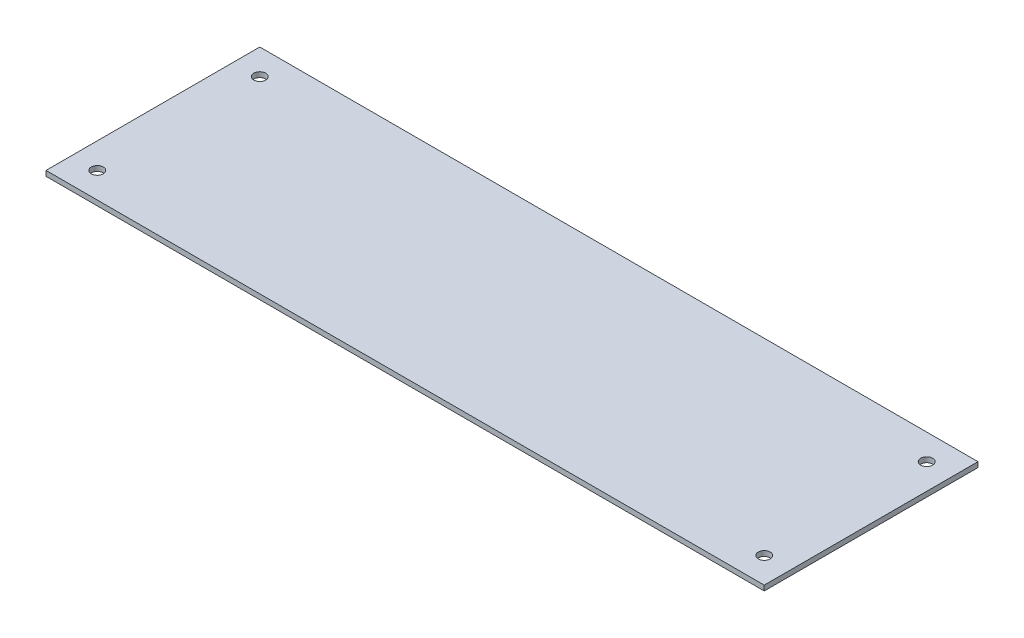
ISO-10303-21;
HEADER;
FILE_DESCRIPTION(('STEP AP214'),'2;1');
FILE_NAME('part.step','',(''),(''),'','','');
FILE_SCHEMA(('AUTOMOTIVE_DESIGN { 1 0 10303 214 1 1 1 1 }'));
ENDSEC;
DATA;
#1=APPLICATION_CONTEXT('core data for automotive mechanical design processes');
#2=APPLICATION_PROTOCOL_DEFINITION('international standard','automotive_design',2000,#1);
#3=PRODUCT_CONTEXT('',#1,'mechanical');
#4=PRODUCT('Part','Part','',(#3));
#5=PRODUCT_RELATED_PRODUCT_CATEGORY('part','',(#4));
#6=PRODUCT_DEFINITION_FORMATION('','',#4);
#7=PRODUCT_DEFINITION_CONTEXT('part definition',#1,'design');
#8=PRODUCT_DEFINITION('design','',#6,#7);
#9=PRODUCT_DEFINITION_SHAPE('','',#8);
#10=(LENGTH_UNIT() NAMED_UNIT(*) SI_UNIT(.MILLI.,.METRE.));
#11=(NAMED_UNIT(*) PLANE_ANGLE_UNIT() SI_UNIT($,.RADIAN.));
#12=(NAMED_UNIT(*) SI_UNIT($,.STERADIAN.) SOLID_ANGLE_UNIT());
#13=UNCERTAINTY_MEASURE_WITH_UNIT(LENGTH_MEASURE(1.E-05),#10,'distance_accuracy_value','');
#14=(GEOMETRIC_REPRESENTATION_CONTEXT(3) GLOBAL_UNCERTAINTY_ASSIGNED_CONTEXT((#13)) GLOBAL_UNIT_ASSIGNED_CONTEXT((#10,
#11,#12)) REPRESENTATION_CONTEXT('',''));
#15=CARTESIAN_POINT('',(0.,0.,0.));
#16=DIRECTION('',(0.,0.,1.));
#17=DIRECTION('',(1.,0.,0.));
#18=AXIS2_PLACEMENT_3D('',#15,#16,#17);
#19=CARTESIAN_POINT('',(210.,-3.,-62.5));
#20=DIRECTION('',(1.,0.,0.));
#21=DIRECTION('',(0.,0.,-1.));
#22=AXIS2_PLACEMENT_3D('',#19,#20,#21);
#23=PLANE('',#22);
#24=DIRECTION('',(0.,0.,-1.));
#25=VECTOR('',#24,1.);
#26=CARTESIAN_POINT('',(210.,0.,-62.5));
#27=LINE('',#26,#25);
#28=CARTESIAN_POINT('',(210.,0.,62.5));
#29=VERTEX_POINT('',#28);
#30=CARTESIAN_POINT('',(210.,0.,-62.5));
#31=VERTEX_POINT('',#30);
#32=EDGE_CURVE('E101',#29,#31,#27,.T.);
#33=ORIENTED_EDGE('',*,*,#32,.F.);
#34=DIRECTION('',(0.,1.,0.));
#35=VECTOR('',#34,1.);
#36=CARTESIAN_POINT('',(210.,-3.,62.5));
#37=LINE('',#36,#35);
#38=CARTESIAN_POINT('',(210.,-3.,62.5));
#39=VERTEX_POINT('',#38);
#40=EDGE_CURVE('E11',#39,#29,#37,.T.);
#41=ORIENTED_EDGE('',*,*,#40,.F.);
#42=DIRECTION('',(0.,0.,-1.));
#43=VECTOR('',#42,1.);
#44=CARTESIAN_POINT('',(210.,-3.,-62.5));
#45=LINE('',#44,#43);
#46=CARTESIAN_POINT('',(210.,-3.,-62.5));
#47=VERTEX_POINT('',#46);
#48=EDGE_CURVE('E94',#39,#47,#45,.T.);
#49=ORIENTED_EDGE('',*,*,#48,.T.);
#50=DIRECTION('',(0.,1.,0.));
#51=VECTOR('',#50,1.);
#52=CARTESIAN_POINT('',(210.,-3.,-62.5));
#53=LINE('',#52,#51);
#54=EDGE_CURVE('E39',#47,#31,#53,.T.);
#55=ORIENTED_EDGE('',*,*,#54,.T.);
#56=EDGE_LOOP('',(#33,#41,#49,#55));
#57=FACE_BOUND('',#56,.T.);
#58=ADVANCED_FACE('F36',(#57),#23,.T.);
#59=CARTESIAN_POINT('',(-210.,-3.,62.5));
#60=DIRECTION('',(0.,0.,1.));
#61=DIRECTION('',(1.,0.,0.));
#62=AXIS2_PLACEMENT_3D('',#59,#60,#61);
#63=PLANE('',#62);
#64=DIRECTION('',(1.,0.,0.));
#65=VECTOR('',#64,1.);
#66=CARTESIAN_POINT('',(-210.,0.,62.5));
#67=LINE('',#66,#65);
#68=CARTESIAN_POINT('',(-210.,0.,62.5));
#69=VERTEX_POINT('',#68);
#70=EDGE_CURVE('E96',#69,#29,#67,.T.);
#71=ORIENTED_EDGE('',*,*,#70,.F.);
#72=DIRECTION('',(0.,1.,0.));
#73=VECTOR('',#72,1.);
#74=CARTESIAN_POINT('',(-210.,-3.,62.5));
#75=LINE('',#74,#73);
#76=CARTESIAN_POINT('',(-210.,-3.,62.5));
#77=VERTEX_POINT('',#76);
#78=EDGE_CURVE('E45',#77,#69,#75,.T.);
#79=ORIENTED_EDGE('',*,*,#78,.F.);
#80=DIRECTION('',(1.,0.,0.));
#81=VECTOR('',#80,1.);
#82=CARTESIAN_POINT('',(-210.,-3.,62.5));
#83=LINE('',#82,#81);
#84=EDGE_CURVE('E91',#77,#39,#83,.T.);
#85=ORIENTED_EDGE('',*,*,#84,.T.);
#86=ORIENTED_EDGE('',*,*,#40,.T.);
#87=EDGE_LOOP('',(#71,#79,#85,#86));
#88=FACE_BOUND('',#87,.T.);
#89=ADVANCED_FACE('F112',(#88),#63,.T.);
#90=CARTESIAN_POINT('',(-210.,-3.,-62.5));
#91=DIRECTION('',(-1.,0.,0.));
#92=DIRECTION('',(0.,0.,1.));
#93=AXIS2_PLACEMENT_3D('',#90,#91,#92);
#94=PLANE('',#93);
#95=DIRECTION('',(0.,0.,1.));
#96=VECTOR('',#95,1.);
#97=CARTESIAN_POINT('',(-210.,0.,-62.5));
#98=LINE('',#97,#96);
#99=CARTESIAN_POINT('',(-210.,0.,-62.5));
#100=VERTEX_POINT('',#99);
#101=EDGE_CURVE('E86',#100,#69,#98,.T.);
#102=ORIENTED_EDGE('',*,*,#101,.F.);
#103=DIRECTION('',(0.,1.,0.));
#104=VECTOR('',#103,1.);
#105=CARTESIAN_POINT('',(-210.,-3.,-62.5));
#106=LINE('',#105,#104);
#107=CARTESIAN_POINT('',(-210.,-3.,-62.5));
#108=VERTEX_POINT('',#107);
#109=EDGE_CURVE('E81',#108,#100,#106,.T.);
#110=ORIENTED_EDGE('',*,*,#109,.F.);
#111=DIRECTION('',(0.,0.,1.));
#112=VECTOR('',#111,1.);
#113=CARTESIAN_POINT('',(-210.,-3.,-62.5));
#114=LINE('',#113,#112);
#115=EDGE_CURVE('E84',#108,#77,#114,.T.);
#116=ORIENTED_EDGE('',*,*,#115,.T.);
#117=ORIENTED_EDGE('',*,*,#78,.T.);
#118=EDGE_LOOP('',(#102,#110,#116,#117));
#119=FACE_BOUND('',#118,.T.);
#120=ADVANCED_FACE('F83',(#119),#94,.T.);
#121=CARTESIAN_POINT('',(-210.,-3.,-62.5));
#122=DIRECTION('',(0.,0.,-1.));
#123=DIRECTION('',(-1.,0.,0.));
#124=AXIS2_PLACEMENT_3D('',#121,#122,#123);
#125=PLANE('',#124);
#126=DIRECTION('',(-1.,0.,0.));
#127=VECTOR('',#126,1.);
#128=CARTESIAN_POINT('',(-210.,0.,-62.5));
#129=LINE('',#128,#127);
#130=EDGE_CURVE('E104',#31,#100,#129,.T.);
#131=ORIENTED_EDGE('',*,*,#130,.F.);
#132=ORIENTED_EDGE('',*,*,#54,.F.);
#133=DIRECTION('',(-1.,0.,0.));
#134=VECTOR('',#133,1.);
#135=CARTESIAN_POINT('',(-210.,-3.,-62.5));
#136=LINE('',#135,#134);
#137=EDGE_CURVE('E90',#47,#108,#136,.T.);
#138=ORIENTED_EDGE('',*,*,#137,.T.);
#139=ORIENTED_EDGE('',*,*,#109,.T.);
#140=EDGE_LOOP('',(#131,#132,#138,#139));
#141=FACE_BOUND('',#140,.T.);
#142=ADVANCED_FACE('F93',(#141),#125,.T.);
#143=CARTESIAN_POINT('',(0.,-3.,0.));
#144=DIRECTION('',(0.,1.,0.));
#145=DIRECTION('',(0.,0.,1.));
#146=AXIS2_PLACEMENT_3D('',#143,#144,#145);
#147=PLANE('',#146);
#148=CARTESIAN_POINT('',(-195.,-3.,-47.5004167193447));
#149=DIRECTION('',(0.,1.,0.));
#150=DIRECTION('',(0.,0.,1.));
#151=AXIS2_PLACEMENT_3D('',#148,#149,#150);
#152=CIRCLE('',#151,3.49999999999999);
#153=CARTESIAN_POINT('',(-195.,-3.,-44.0004167193447));
#154=VERTEX_POINT('',#153);
#155=EDGE_CURVE('E105',#154,#154,#152,.T.);
#156=ORIENTED_EDGE('',*,*,#155,.T.);
#157=EDGE_LOOP('',(#156));
#158=FACE_BOUND('',#157,.T.);
#159=CARTESIAN_POINT('',(195.,-3.,-47.5004167193447));
#160=DIRECTION('',(0.,1.,0.));
#161=DIRECTION('',(0.,0.,1.));
#162=AXIS2_PLACEMENT_3D('',#159,#160,#161);
#163=CIRCLE('',#162,3.49999999999999);
#164=CARTESIAN_POINT('',(195.,-3.,-44.0004167193447));
#165=VERTEX_POINT('',#164);
#166=EDGE_CURVE('E163',#165,#165,#163,.T.);
#167=ORIENTED_EDGE('',*,*,#166,.T.);
#168=EDGE_LOOP('',(#167));
#169=FACE_BOUND('',#168,.T.);
#170=CARTESIAN_POINT('',(195.,-3.,47.5004167193447));
#171=DIRECTION('',(0.,1.,0.));
#172=DIRECTION('',(0.,0.,1.));
#173=AXIS2_PLACEMENT_3D('',#170,#171,#172);
#174=CIRCLE('',#173,3.49999999999999);
#175=CARTESIAN_POINT('',(195.,-3.,51.0004167193447));
#176=VERTEX_POINT('',#175);
#177=EDGE_CURVE('E161',#176,#176,#174,.T.);
#178=ORIENTED_EDGE('',*,*,#177,.T.);
#179=EDGE_LOOP('',(#178));
#180=FACE_BOUND('',#179,.T.);
#181=CARTESIAN_POINT('',(-195.,-3.,47.5004167193447));
#182=DIRECTION('',(0.,1.,0.));
#183=DIRECTION('',(0.,0.,1.));
#184=AXIS2_PLACEMENT_3D('',#181,#182,#183);
#185=CIRCLE('',#184,3.49999999999999);
#186=CARTESIAN_POINT('',(-195.,-3.,51.0004167193447));
#187=VERTEX_POINT('',#186);
#188=EDGE_CURVE('E164',#187,#187,#185,.T.);
#189=ORIENTED_EDGE('',*,*,#188,.T.);
#190=EDGE_LOOP('',(#189));
#191=FACE_BOUND('',#190,.T.);
#192=ORIENTED_EDGE('',*,*,#48,.F.);
#193=ORIENTED_EDGE('',*,*,#84,.F.);
#194=ORIENTED_EDGE('',*,*,#115,.F.);
#195=ORIENTED_EDGE('',*,*,#137,.F.);
#196=EDGE_LOOP('',(#192,#193,#194,#195));
#197=FACE_BOUND('',#196,.T.);
#198=ADVANCED_FACE('F89',(#158,#169,#180,#191,#197),#147,.F.);
#199=CARTESIAN_POINT('',(0.,0.,0.));
#200=DIRECTION('',(0.,1.,0.));
#201=DIRECTION('',(0.,0.,1.));
#202=AXIS2_PLACEMENT_3D('',#199,#200,#201);
#203=PLANE('',#202);
#204=CARTESIAN_POINT('',(-195.,0.,-47.5004167193447));
#205=DIRECTION('',(0.,1.,0.));
#206=DIRECTION('',(0.,0.,-1.));
#207=AXIS2_PLACEMENT_3D('',#204,#205,#206);
#208=CIRCLE('',#207,3.49999999999999);
#209=CARTESIAN_POINT('',(-195.,0.,-51.0004167193447));
#210=VERTEX_POINT('',#209);
#211=EDGE_CURVE('E176',#210,#210,#208,.T.);
#212=ORIENTED_EDGE('',*,*,#211,.F.);
#213=EDGE_LOOP('',(#212));
#214=FACE_BOUND('',#213,.T.);
#215=CARTESIAN_POINT('',(195.,0.,-47.5004167193447));
#216=DIRECTION('',(0.,1.,0.));
#217=DIRECTION('',(0.,0.,1.));
#218=AXIS2_PLACEMENT_3D('',#215,#216,#217);
#219=CIRCLE('',#218,3.49999999999999);
#220=CARTESIAN_POINT('',(195.,0.,-44.0004167193447));
#221=VERTEX_POINT('',#220);
#222=EDGE_CURVE('E179',#221,#221,#219,.T.);
#223=ORIENTED_EDGE('',*,*,#222,.F.);
#224=EDGE_LOOP('',(#223));
#225=FACE_BOUND('',#224,.T.);
#226=CARTESIAN_POINT('',(195.,0.,47.5004167193447));
#227=DIRECTION('',(0.,1.,0.));
#228=DIRECTION('',(0.,0.,-1.));
#229=AXIS2_PLACEMENT_3D('',#226,#227,#228);
#230=CIRCLE('',#229,3.49999999999999);
#231=CARTESIAN_POINT('',(195.,0.,44.0004167193447));
#232=VERTEX_POINT('',#231);
#233=EDGE_CURVE('E158',#232,#232,#230,.T.);
#234=ORIENTED_EDGE('',*,*,#233,.F.);
#235=EDGE_LOOP('',(#234));
#236=FACE_BOUND('',#235,.T.);
#237=CARTESIAN_POINT('',(-195.,0.,47.5004167193447));
#238=DIRECTION('',(0.,1.,0.));
#239=DIRECTION('',(0.,0.,1.));
#240=AXIS2_PLACEMENT_3D('',#237,#238,#239);
#241=CIRCLE('',#240,3.49999999999999);
#242=CARTESIAN_POINT('',(-195.,0.,51.0004167193447));
#243=VERTEX_POINT('',#242);
#244=EDGE_CURVE('E169',#243,#243,#241,.T.);
#245=ORIENTED_EDGE('',*,*,#244,.F.);
#246=EDGE_LOOP('',(#245));
#247=FACE_BOUND('',#246,.T.);
#248=ORIENTED_EDGE('',*,*,#32,.T.);
#249=ORIENTED_EDGE('',*,*,#130,.T.);
#250=ORIENTED_EDGE('',*,*,#101,.T.);
#251=ORIENTED_EDGE('',*,*,#70,.T.);
#252=EDGE_LOOP('',(#248,#249,#250,#251));
#253=FACE_BOUND('',#252,.T.);
#254=ADVANCED_FACE('F111',(#214,#225,#236,#247,#253),#203,.T.);
#255=CARTESIAN_POINT('',(-195.,-10.,47.5004167193447));
#256=DIRECTION('',(0.,1.,0.));
#257=DIRECTION('',(0.,0.,1.));
#258=AXIS2_PLACEMENT_3D('',#255,#256,#257);
#259=CYLINDRICAL_SURFACE('',#258,3.49999999999999);
#260=ORIENTED_EDGE('',*,*,#244,.T.);
#261=EDGE_LOOP('',(#260));
#262=FACE_BOUND('',#261,.T.);
#263=ORIENTED_EDGE('',*,*,#188,.F.);
#264=EDGE_LOOP('',(#263));
#265=FACE_BOUND('',#264,.T.);
#266=ADVANCED_FACE('F133',(#262,#265),#259,.F.);
#267=CARTESIAN_POINT('',(195.,-10.,47.5004167193447));
#268=DIRECTION('',(0.,1.,0.));
#269=DIRECTION('',(0.,0.,1.));
#270=AXIS2_PLACEMENT_3D('',#267,#268,#269);
#271=CYLINDRICAL_SURFACE('',#270,3.49999999999999);
#272=ORIENTED_EDGE('',*,*,#233,.T.);
#273=EDGE_LOOP('',(#272));
#274=FACE_BOUND('',#273,.T.);
#275=ORIENTED_EDGE('',*,*,#177,.F.);
#276=EDGE_LOOP('',(#275));
#277=FACE_BOUND('',#276,.T.);
#278=ADVANCED_FACE('F140',(#274,#277),#271,.F.);
#279=CARTESIAN_POINT('',(195.,-10.,-47.5004167193447));
#280=DIRECTION('',(0.,1.,0.));
#281=DIRECTION('',(0.,0.,1.));
#282=AXIS2_PLACEMENT_3D('',#279,#280,#281);
#283=CYLINDRICAL_SURFACE('',#282,3.49999999999999);
#284=ORIENTED_EDGE('',*,*,#222,.T.);
#285=EDGE_LOOP('',(#284));
#286=FACE_BOUND('',#285,.T.);
#287=ORIENTED_EDGE('',*,*,#166,.F.);
#288=EDGE_LOOP('',(#287));
#289=FACE_BOUND('',#288,.T.);
#290=ADVANCED_FACE('F145',(#286,#289),#283,.F.);
#291=CARTESIAN_POINT('',(-195.,-10.,-47.5004167193447));
#292=DIRECTION('',(0.,1.,0.));
#293=DIRECTION('',(0.,0.,1.));
#294=AXIS2_PLACEMENT_3D('',#291,#292,#293);
#295=CYLINDRICAL_SURFACE('',#294,3.49999999999999);
#296=ORIENTED_EDGE('',*,*,#211,.T.);
#297=EDGE_LOOP('',(#296));
#298=FACE_BOUND('',#297,.T.);
#299=ORIENTED_EDGE('',*,*,#155,.F.);
#300=EDGE_LOOP('',(#299));
#301=FACE_BOUND('',#300,.T.);
#302=ADVANCED_FACE('F142',(#298,#301),#295,.F.);
#303=CLOSED_SHELL('',(#58,#89,#120,#142,#198,#254,#266,#278,#290,#302));
#304=MANIFOLD_SOLID_BREP('B2',#303);
#305=ADVANCED_BREP_SHAPE_REPRESENTATION('',(#18,#304),#14);
#306=SHAPE_DEFINITION_REPRESENTATION(#9,#305);
ENDSEC;
END-ISO-10303-21;
